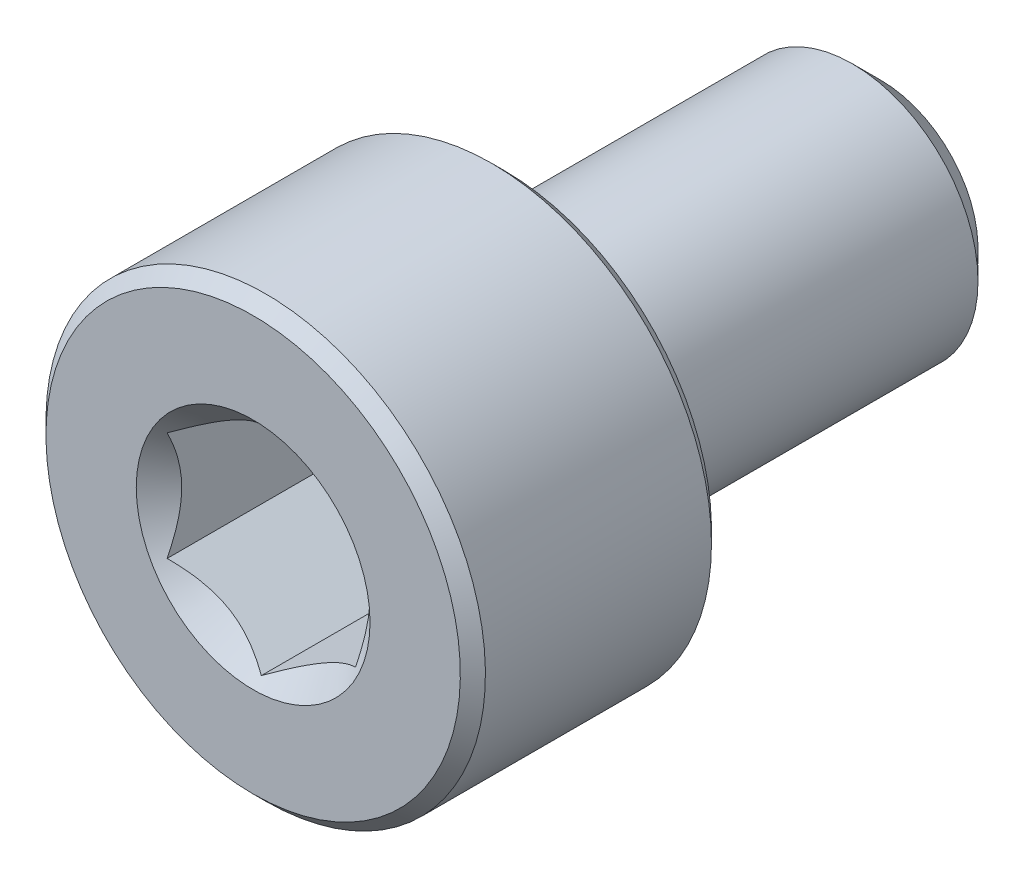
ISO-10303-21;
HEADER;
FILE_DESCRIPTION(('STEP AP214'),'2;1');
FILE_NAME('part.step','',(''),(''),'','','');
FILE_SCHEMA(('AUTOMOTIVE_DESIGN { 1 0 10303 214 1 1 1 1 }'));
ENDSEC;
DATA;
#1=APPLICATION_CONTEXT('core data for automotive mechanical design processes');
#2=APPLICATION_PROTOCOL_DEFINITION('international standard','automotive_design',2000,#1);
#3=PRODUCT_CONTEXT('',#1,'mechanical');
#4=PRODUCT('Part','Part','',(#3));
#5=PRODUCT_RELATED_PRODUCT_CATEGORY('part','',(#4));
#6=PRODUCT_DEFINITION_FORMATION('','',#4);
#7=PRODUCT_DEFINITION_CONTEXT('part definition',#1,'design');
#8=PRODUCT_DEFINITION('design','',#6,#7);
#9=PRODUCT_DEFINITION_SHAPE('','',#8);
#10=(LENGTH_UNIT() NAMED_UNIT(*) SI_UNIT(.MILLI.,.METRE.));
#11=(NAMED_UNIT(*) PLANE_ANGLE_UNIT() SI_UNIT($,.RADIAN.));
#12=(NAMED_UNIT(*) SI_UNIT($,.STERADIAN.) SOLID_ANGLE_UNIT());
#13=UNCERTAINTY_MEASURE_WITH_UNIT(LENGTH_MEASURE(1.E-05),#10,'distance_accuracy_value','');
#14=(GEOMETRIC_REPRESENTATION_CONTEXT(3) GLOBAL_UNCERTAINTY_ASSIGNED_CONTEXT((#13)) GLOBAL_UNIT_ASSIGNED_CONTEXT((#10,
#11,#12)) REPRESENTATION_CONTEXT('',''));
#15=CARTESIAN_POINT('',(0.,0.,0.));
#16=DIRECTION('',(0.,0.,1.));
#17=DIRECTION('',(1.,0.,0.));
#18=AXIS2_PLACEMENT_3D('',#15,#16,#17);
#19=CARTESIAN_POINT('',(1.5,-0.866025403784439,-3.58257569495584));
#20=DIRECTION('',(1.,0.,0.));
#21=DIRECTION('',(0.,1.,0.));
#22=AXIS2_PLACEMENT_3D('',#19,#20,#21);
#23=PLANE('',#22);
#24=DIRECTION('',(0.,0.,1.));
#25=VECTOR('',#24,1.);
#26=CARTESIAN_POINT('',(1.5,-0.866025403784439,-3.58257569495584));
#27=LINE('',#26,#25);
#28=CARTESIAN_POINT('',(1.5,-0.866025403784439,2.));
#29=VERTEX_POINT('',#28);
#30=CARTESIAN_POINT('',(1.5,-0.866025403784439,4.87009618943233));
#31=VERTEX_POINT('',#30);
#32=EDGE_CURVE('E136',#29,#31,#27,.T.);
#33=ORIENTED_EDGE('',*,*,#32,.T.);
#34=CARTESIAN_POINT('',(1.5,-0.866025403784437,4.87009618943233));
#35=CARTESIAN_POINT('',(1.5,0.,4.43708348754012));
#36=CARTESIAN_POINT('',(1.5,0.866025403784436,4.87009618943233));
#37=(BOUNDED_CURVE() B_SPLINE_CURVE(2,(#34,#35,#36),.UNSPECIFIED.,.F.,
.F.) B_SPLINE_CURVE_WITH_KNOTS((3,3),(-0.41309519357444,-0.145320587654442),
.UNSPECIFIED.) CURVE() GEOMETRIC_REPRESENTATION_ITEM() RATIONAL_B_SPLINE_CURVE((1.34959345562317,
1.55837628980119,1.34959345562317)) REPRESENTATION_ITEM(''));
#38=CARTESIAN_POINT('',(1.5,0.866025403784439,4.87009618943233));
#39=VERTEX_POINT('',#38);
#40=EDGE_CURVE('E139',#31,#39,#37,.T.);
#41=ORIENTED_EDGE('',*,*,#40,.T.);
#42=DIRECTION('',(0.,0.,1.));
#43=VECTOR('',#42,1.);
#44=CARTESIAN_POINT('',(1.5,0.866025403784439,-3.58257569495584));
#45=LINE('',#44,#43);
#46=CARTESIAN_POINT('',(1.5,0.866025403784439,2.));
#47=VERTEX_POINT('',#46);
#48=EDGE_CURVE('E11',#47,#39,#45,.T.);
#49=ORIENTED_EDGE('',*,*,#48,.F.);
#50=DIRECTION('',(0.,1.,0.));
#51=VECTOR('',#50,1.);
#52=CARTESIAN_POINT('',(1.5,-0.866025403784439,2.));
#53=LINE('',#52,#51);
#54=EDGE_CURVE('E141',#29,#47,#53,.T.);
#55=ORIENTED_EDGE('',*,*,#54,.F.);
#56=EDGE_LOOP('',(#33,#41,#49,#55));
#57=FACE_BOUND('',#56,.T.);
#58=ADVANCED_FACE('F17',(#57),#23,.F.);
#59=CARTESIAN_POINT('',(1.5,0.866025403784439,-3.58257569495584));
#60=DIRECTION('',(0.5,0.866025403784439,0.));
#61=DIRECTION('',(0.,0.,-1.));
#62=AXIS2_PLACEMENT_3D('',#59,#60,#61);
#63=PLANE('',#62);
#64=ORIENTED_EDGE('',*,*,#48,.T.);
#65=CARTESIAN_POINT('',(1.5,0.86602540378444,4.87009618943233));
#66=CARTESIAN_POINT('',(0.749999999999998,1.29903810567666,4.43708348754012));
#67=CARTESIAN_POINT('',(0.,1.73205080756888,4.87009618943233));
#68=(BOUNDED_CURVE() B_SPLINE_CURVE(2,(#65,#66,#67),.UNSPECIFIED.,.F.,
.F.) B_SPLINE_CURVE_WITH_KNOTS((3,3),(-0.413095193574439,-0.145320587654442),
.UNSPECIFIED.) CURVE() GEOMETRIC_REPRESENTATION_ITEM() RATIONAL_B_SPLINE_CURVE((1.34959345562317,
1.55837628980119,1.34959345562317)) REPRESENTATION_ITEM(''));
#69=CARTESIAN_POINT('',(0.,1.73205080756888,4.87009618943233));
#70=VERTEX_POINT('',#69);
#71=EDGE_CURVE('E161',#39,#70,#68,.T.);
#72=ORIENTED_EDGE('',*,*,#71,.T.);
#73=DIRECTION('',(0.,0.,1.));
#74=VECTOR('',#73,1.);
#75=CARTESIAN_POINT('',(0.,1.73205080756888,-3.58257569495584));
#76=LINE('',#75,#74);
#77=CARTESIAN_POINT('',(0.,1.73205080756888,2.));
#78=VERTEX_POINT('',#77);
#79=EDGE_CURVE('E25',#78,#70,#76,.T.);
#80=ORIENTED_EDGE('',*,*,#79,.F.);
#81=DIRECTION('',(-0.866025403784439,0.5,0.));
#82=VECTOR('',#81,1.);
#83=CARTESIAN_POINT('',(1.5,0.866025403784439,2.));
#84=LINE('',#83,#82);
#85=EDGE_CURVE('E286',#47,#78,#84,.T.);
#86=ORIENTED_EDGE('',*,*,#85,.F.);
#87=EDGE_LOOP('',(#64,#72,#80,#86));
#88=FACE_BOUND('',#87,.T.);
#89=ADVANCED_FACE('F308',(#88),#63,.F.);
#90=CARTESIAN_POINT('',(0.,1.73205080756888,-3.58257569495584));
#91=DIRECTION('',(-0.5,0.866025403784439,0.));
#92=DIRECTION('',(0.,0.,1.));
#93=AXIS2_PLACEMENT_3D('',#90,#91,#92);
#94=PLANE('',#93);
#95=ORIENTED_EDGE('',*,*,#79,.T.);
#96=CARTESIAN_POINT('',(0.,1.73205080756888,4.87009618943233));
#97=CARTESIAN_POINT('',(-0.75,1.29903810567666,4.43708348754012));
#98=CARTESIAN_POINT('',(-1.5,0.86602540378444,4.87009618943233));
#99=(BOUNDED_CURVE() B_SPLINE_CURVE(2,(#96,#97,#98),.UNSPECIFIED.,.F.,
.F.) B_SPLINE_CURVE_WITH_KNOTS((3,3),(-0.41309519357444,-0.145320587654442),
.UNSPECIFIED.) CURVE() GEOMETRIC_REPRESENTATION_ITEM() RATIONAL_B_SPLINE_CURVE((1.34959345562317,
1.55837628980119,1.34959345562317)) REPRESENTATION_ITEM(''));
#100=CARTESIAN_POINT('',(-1.5,0.866025403784439,4.87009618943233));
#101=VERTEX_POINT('',#100);
#102=EDGE_CURVE('E170',#70,#101,#99,.T.);
#103=ORIENTED_EDGE('',*,*,#102,.T.);
#104=DIRECTION('',(0.,0.,1.));
#105=VECTOR('',#104,1.);
#106=CARTESIAN_POINT('',(-1.5,0.866025403784438,-3.58257569495584));
#107=LINE('',#106,#105);
#108=CARTESIAN_POINT('',(-1.5,0.866025403784439,2.));
#109=VERTEX_POINT('',#108);
#110=EDGE_CURVE('E47',#109,#101,#107,.T.);
#111=ORIENTED_EDGE('',*,*,#110,.F.);
#112=DIRECTION('',(-0.866025403784439,-0.5,0.));
#113=VECTOR('',#112,1.);
#114=CARTESIAN_POINT('',(0.,1.73205080756888,2.));
#115=LINE('',#114,#113);
#116=EDGE_CURVE('E212',#78,#109,#115,.T.);
#117=ORIENTED_EDGE('',*,*,#116,.F.);
#118=EDGE_LOOP('',(#95,#103,#111,#117));
#119=FACE_BOUND('',#118,.T.);
#120=ADVANCED_FACE('F304',(#119),#94,.F.);
#121=CARTESIAN_POINT('',(-1.5,0.866025403784438,-3.58257569495584));
#122=DIRECTION('',(-1.,0.,0.));
#123=DIRECTION('',(0.,0.,1.));
#124=AXIS2_PLACEMENT_3D('',#121,#122,#123);
#125=PLANE('',#124);
#126=ORIENTED_EDGE('',*,*,#110,.T.);
#127=CARTESIAN_POINT('',(-1.5,0.866025403784437,4.87009618943233));
#128=CARTESIAN_POINT('',(-1.5,0.401923788646683,4.63804538186346));
#129=CARTESIAN_POINT('',(-1.5,0.,4.63804538186346));
#130=(BOUNDED_CURVE() B_SPLINE_CURVE(2,(#127,#128,#129),.UNSPECIFIED.,.F.,
.F.) B_SPLINE_CURVE_WITH_KNOTS((3,3),(-0.41309519357444,-0.279207890614441),
.UNSPECIFIED.) CURVE() GEOMETRIC_REPRESENTATION_ITEM() RATIONAL_B_SPLINE_CURVE((1.34959345562317,
1.45398487271218,1.45398487271218)) REPRESENTATION_ITEM(''));
#131=CARTESIAN_POINT('',(-1.5,0.,4.63804538186346));
#132=VERTEX_POINT('',#131);
#133=EDGE_CURVE('E225',#101,#132,#130,.T.);
#134=ORIENTED_EDGE('',*,*,#133,.T.);
#135=CARTESIAN_POINT('',(-1.5,0.,4.63804538186346));
#136=CARTESIAN_POINT('',(-1.5,-0.401923788646682,4.63804538186346));
#137=CARTESIAN_POINT('',(-1.5,-0.866025403784434,4.87009618943233));
#138=(BOUNDED_CURVE() B_SPLINE_CURVE(2,(#135,#136,#137),.UNSPECIFIED.,.F.,
.F.) B_SPLINE_CURVE_WITH_KNOTS((3,3),(-0.279207890614441,-0.145320587654442),
.UNSPECIFIED.) CURVE() GEOMETRIC_REPRESENTATION_ITEM() RATIONAL_B_SPLINE_CURVE((1.45398487271218,
1.45398487271218,1.34959345562317)) REPRESENTATION_ITEM(''));
#139=CARTESIAN_POINT('',(-1.5,-0.866025403784439,4.87009618943233));
#140=VERTEX_POINT('',#139);
#141=EDGE_CURVE('E187',#132,#140,#138,.T.);
#142=ORIENTED_EDGE('',*,*,#141,.T.);
#143=DIRECTION('',(0.,0.,1.));
#144=VECTOR('',#143,1.);
#145=CARTESIAN_POINT('',(-1.5,-0.866025403784439,-3.58257569495584));
#146=LINE('',#145,#144);
#147=CARTESIAN_POINT('',(-1.5,-0.866025403784439,2.));
#148=VERTEX_POINT('',#147);
#149=EDGE_CURVE('E37',#148,#140,#146,.T.);
#150=ORIENTED_EDGE('',*,*,#149,.F.);
#151=DIRECTION('',(0.,-1.,0.));
#152=VECTOR('',#151,1.);
#153=CARTESIAN_POINT('',(-1.5,0.866025403784438,2.));
#154=LINE('',#153,#152);
#155=EDGE_CURVE('E204',#109,#148,#154,.T.);
#156=ORIENTED_EDGE('',*,*,#155,.F.);
#157=EDGE_LOOP('',(#126,#134,#142,#150,#156));
#158=FACE_BOUND('',#157,.T.);
#159=ADVANCED_FACE('F449',(#158),#125,.F.);
#160=CARTESIAN_POINT('',(-1.5,-0.866025403784439,-3.58257569495584));
#161=DIRECTION('',(-0.5,-0.866025403784439,0.));
#162=DIRECTION('',(-0.866025403784439,0.5,0.));
#163=AXIS2_PLACEMENT_3D('',#160,#161,#162);
#164=PLANE('',#163);
#165=ORIENTED_EDGE('',*,*,#149,.T.);
#166=CARTESIAN_POINT('',(-1.5,-0.866025403784442,4.87009618943233));
#167=CARTESIAN_POINT('',(-0.749999999999998,-1.29903810567666,4.43708348754012));
#168=CARTESIAN_POINT('',(0.,-1.73205080756888,4.87009618943233));
#169=(BOUNDED_CURVE() B_SPLINE_CURVE(2,(#166,#167,#168),.UNSPECIFIED.,.F.,
.F.) B_SPLINE_CURVE_WITH_KNOTS((3,3),(-0.413095193574439,-0.145320587654442),
.UNSPECIFIED.) CURVE() GEOMETRIC_REPRESENTATION_ITEM() RATIONAL_B_SPLINE_CURVE((1.34959345562317,
1.55837628980119,1.34959345562317)) REPRESENTATION_ITEM(''));
#170=CARTESIAN_POINT('',(0.,-1.73205080756888,4.87009618943233));
#171=VERTEX_POINT('',#170);
#172=EDGE_CURVE('E155',#140,#171,#169,.T.);
#173=ORIENTED_EDGE('',*,*,#172,.T.);
#174=DIRECTION('',(0.,0.,1.));
#175=VECTOR('',#174,1.);
#176=CARTESIAN_POINT('',(0.,-1.73205080756888,-3.58257569495584));
#177=LINE('',#176,#175);
#178=CARTESIAN_POINT('',(0.,-1.73205080756888,2.));
#179=VERTEX_POINT('',#178);
#180=EDGE_CURVE('E146',#179,#171,#177,.T.);
#181=ORIENTED_EDGE('',*,*,#180,.F.);
#182=DIRECTION('',(0.866025403784439,-0.5,0.));
#183=VECTOR('',#182,1.);
#184=CARTESIAN_POINT('',(-1.5,-0.866025403784439,2.));
#185=LINE('',#184,#183);
#186=EDGE_CURVE('E211',#148,#179,#185,.T.);
#187=ORIENTED_EDGE('',*,*,#186,.F.);
#188=EDGE_LOOP('',(#165,#173,#181,#187));
#189=FACE_BOUND('',#188,.T.);
#190=ADVANCED_FACE('F454',(#189),#164,.F.);
#191=CARTESIAN_POINT('',(0.,-1.73205080756888,-3.58257569495584));
#192=DIRECTION('',(0.5,-0.866025403784439,0.));
#193=DIRECTION('',(0.,0.,-1.));
#194=AXIS2_PLACEMENT_3D('',#191,#192,#193);
#195=PLANE('',#194);
#196=ORIENTED_EDGE('',*,*,#180,.T.);
#197=CARTESIAN_POINT('',(0.,-1.73205080756887,4.87009618943233));
#198=CARTESIAN_POINT('',(0.750000000000001,-1.29903810567666,4.43708348754012));
#199=CARTESIAN_POINT('',(1.5,-0.86602540378444,4.87009618943233));
#200=(BOUNDED_CURVE() B_SPLINE_CURVE(2,(#197,#198,#199),.UNSPECIFIED.,.F.,
.F.) B_SPLINE_CURVE_WITH_KNOTS((3,3),(-0.413095193574439,-0.145320587654442),
.UNSPECIFIED.) CURVE() GEOMETRIC_REPRESENTATION_ITEM() RATIONAL_B_SPLINE_CURVE((1.34959345562317,
1.55837628980119,1.34959345562317)) REPRESENTATION_ITEM(''));
#201=EDGE_CURVE('E149',#171,#31,#200,.T.);
#202=ORIENTED_EDGE('',*,*,#201,.T.);
#203=ORIENTED_EDGE('',*,*,#32,.F.);
#204=DIRECTION('',(0.866025403784439,0.5,0.));
#205=VECTOR('',#204,1.);
#206=CARTESIAN_POINT('',(0.,-1.73205080756888,2.));
#207=LINE('',#206,#205);
#208=EDGE_CURVE('E281',#179,#29,#207,.T.);
#209=ORIENTED_EDGE('',*,*,#208,.F.);
#210=EDGE_LOOP('',(#196,#202,#203,#209));
#211=FACE_BOUND('',#210,.T.);
#212=ADVANCED_FACE('F150',(#211),#195,.F.);
#213=CARTESIAN_POINT('',(0.,3.3,2.));
#214=DIRECTION('',(0.,0.,-1.));
#215=DIRECTION('',(-1.,0.,0.));
#216=AXIS2_PLACEMENT_3D('',#213,#214,#215);
#217=PLANE('',#216);
#218=ORIENTED_EDGE('',*,*,#208,.T.);
#219=ORIENTED_EDGE('',*,*,#54,.T.);
#220=ORIENTED_EDGE('',*,*,#85,.T.);
#221=ORIENTED_EDGE('',*,*,#116,.T.);
#222=ORIENTED_EDGE('',*,*,#155,.T.);
#223=ORIENTED_EDGE('',*,*,#186,.T.);
#224=EDGE_LOOP('',(#218,#219,#220,#221,#222,#223));
#225=FACE_BOUND('',#224,.T.);
#226=ADVANCED_FACE('F423',(#225),#217,.F.);
#227=CARTESIAN_POINT('',(0.,0.,5.));
#228=DIRECTION('',(0.,0.,1.));
#229=DIRECTION('',(0.,-1.,0.));
#230=AXIS2_PLACEMENT_3D('',#227,#228,#229);
#231=PLANE('',#230);
#232=CARTESIAN_POINT('',(0.,0.,5.));
#233=DIRECTION('',(0.,0.,1.));
#234=DIRECTION('',(1.,0.,0.));
#235=AXIS2_PLACEMENT_3D('',#232,#233,#234);
#236=CIRCLE('',#235,1.86195461813654);
#237=CARTESIAN_POINT('',(-1.86195461813654,0.,5.));
#238=VERTEX_POINT('',#237);
#239=EDGE_CURVE('E216',#238,#238,#236,.T.);
#240=ORIENTED_EDGE('',*,*,#239,.F.);
#241=EDGE_LOOP('',(#240));
#242=FACE_BOUND('',#241,.T.);
#243=CARTESIAN_POINT('',(0.,0.,5.));
#244=DIRECTION('',(0.,0.,-1.));
#245=DIRECTION('',(0.,1.,0.));
#246=AXIS2_PLACEMENT_3D('',#243,#244,#245);
#247=CIRCLE('',#246,3.3);
#248=CARTESIAN_POINT('',(0.,-3.3,5.));
#249=VERTEX_POINT('',#248);
#250=EDGE_CURVE('E243',#249,#249,#247,.T.);
#251=ORIENTED_EDGE('',*,*,#250,.F.);
#252=EDGE_LOOP('',(#251));
#253=FACE_BOUND('',#252,.T.);
#254=ADVANCED_FACE('F420',(#242,#253),#231,.T.);
#255=CARTESIAN_POINT('',(0.,3.3,1.));
#256=DIRECTION('',(0.,0.,-1.));
#257=DIRECTION('',(-1.,0.,0.));
#258=AXIS2_PLACEMENT_3D('',#255,#256,#257);
#259=PLANE('',#258);
#260=CARTESIAN_POINT('',(0.,0.,1.));
#261=DIRECTION('',(0.,0.,-1.));
#262=DIRECTION('',(0.,1.,0.));
#263=AXIS2_PLACEMENT_3D('',#260,#261,#262);
#264=CIRCLE('',#263,2.2);
#265=CARTESIAN_POINT('',(0.,-2.2,1.));
#266=VERTEX_POINT('',#265);
#267=EDGE_CURVE('E222',#266,#266,#264,.T.);
#268=ORIENTED_EDGE('',*,*,#267,.F.);
#269=EDGE_LOOP('',(#268));
#270=FACE_BOUND('',#269,.T.);
#271=CARTESIAN_POINT('',(0.,0.,1.));
#272=DIRECTION('',(0.,0.,-1.));
#273=DIRECTION('',(0.,1.,0.));
#274=AXIS2_PLACEMENT_3D('',#271,#272,#273);
#275=CIRCLE('',#274,3.3);
#276=CARTESIAN_POINT('',(0.,3.3,1.));
#277=VERTEX_POINT('',#276);
#278=EDGE_CURVE('E237',#277,#277,#275,.T.);
#279=ORIENTED_EDGE('',*,*,#278,.T.);
#280=EDGE_LOOP('',(#279));
#281=FACE_BOUND('',#280,.T.);
#282=ADVANCED_FACE('F422',(#270,#281),#259,.T.);
#283=CARTESIAN_POINT('',(0.,1.54533666301317,-5.));
#284=DIRECTION('',(0.,0.,-1.));
#285=DIRECTION('',(-1.,0.,0.));
#286=AXIS2_PLACEMENT_3D('',#283,#284,#285);
#287=PLANE('',#286);
#288=CARTESIAN_POINT('',(0.,0.,-5.));
#289=DIRECTION('',(0.,0.,-1.));
#290=DIRECTION('',(0.,1.,0.));
#291=AXIS2_PLACEMENT_3D('',#288,#289,#290);
#292=CIRCLE('',#291,1.54533666301317);
#293=CARTESIAN_POINT('',(0.,1.54533666301317,-5.));
#294=VERTEX_POINT('',#293);
#295=EDGE_CURVE('E278',#294,#294,#292,.T.);
#296=ORIENTED_EDGE('',*,*,#295,.T.);
#297=EDGE_LOOP('',(#296));
#298=FACE_BOUND('',#297,.T.);
#299=ADVANCED_FACE('F432',(#298),#287,.T.);
#300=CARTESIAN_POINT('',(0.,0.,-5.));
#301=DIRECTION('',(0.,0.,1.));
#302=DIRECTION('',(0.,-1.,0.));
#303=AXIS2_PLACEMENT_3D('',#300,#301,#302);
#304=CONICAL_SURFACE('',#303,1.54533666301317,0.785398163397446);
#305=CARTESIAN_POINT('',(0.,0.,-4.54533666301317));
#306=DIRECTION('',(0.,0.,-1.));
#307=DIRECTION('',(0.,1.,0.));
#308=AXIS2_PLACEMENT_3D('',#305,#306,#307);
#309=CIRCLE('',#308,2.);
#310=CARTESIAN_POINT('',(0.,2.,-4.54533666301317));
#311=VERTEX_POINT('',#310);
#312=CARTESIAN_POINT('',(0.,-2.,-4.54533666301317));
#313=VERTEX_POINT('',#312);
#314=EDGE_CURVE('E217',#311,#313,#309,.T.);
#315=ORIENTED_EDGE('',*,*,#314,.T.);
#316=CARTESIAN_POINT('',(0.,0.,-4.54533666301317));
#317=DIRECTION('',(0.,0.,-1.));
#318=DIRECTION('',(0.,1.,0.));
#319=AXIS2_PLACEMENT_3D('',#316,#317,#318);
#320=CIRCLE('',#319,2.);
#321=EDGE_CURVE('E221',#313,#311,#320,.T.);
#322=ORIENTED_EDGE('',*,*,#321,.T.);
#323=DIRECTION('',(0.,-0.707106781186546,-0.707106781186549));
#324=VECTOR('',#323,1.);
#325=CARTESIAN_POINT('',(0.,1.54533666301317,-5.));
#326=LINE('',#325,#324);
#327=EDGE_CURVE('E274',#311,#294,#326,.T.);
#328=ORIENTED_EDGE('',*,*,#327,.T.);
#329=ORIENTED_EDGE('',*,*,#295,.F.);
#330=ORIENTED_EDGE('',*,*,#327,.F.);
#331=EDGE_LOOP('',(#315,#322,#328,#329,#330));
#332=FACE_BOUND('',#331,.T.);
#333=ADVANCED_FACE('F457',(#332),#304,.T.);
#334=CARTESIAN_POINT('',(0.,0.,-5.));
#335=DIRECTION('',(0.,0.,-1.));
#336=DIRECTION('',(0.,1.,0.));
#337=AXIS2_PLACEMENT_3D('',#334,#335,#336);
#338=CYLINDRICAL_SURFACE('',#337,2.);
#339=ORIENTED_EDGE('',*,*,#314,.F.);
#340=ORIENTED_EDGE('',*,*,#321,.F.);
#341=DIRECTION('',(0.,0.,1.));
#342=VECTOR('',#341,1.);
#343=CARTESIAN_POINT('',(0.,-2.,-5.));
#344=LINE('',#343,#342);
#345=CARTESIAN_POINT('',(0.,-2.,0.8));
#346=VERTEX_POINT('',#345);
#347=EDGE_CURVE('E269',#313,#346,#344,.T.);
#348=ORIENTED_EDGE('',*,*,#347,.T.);
#349=CARTESIAN_POINT('',(0.,0.,0.8));
#350=DIRECTION('',(0.,0.,-1.));
#351=DIRECTION('',(0.,1.,0.));
#352=AXIS2_PLACEMENT_3D('',#349,#350,#351);
#353=CIRCLE('',#352,2.);
#354=EDGE_CURVE('E258',#346,#346,#353,.T.);
#355=ORIENTED_EDGE('',*,*,#354,.T.);
#356=ORIENTED_EDGE('',*,*,#347,.F.);
#357=EDGE_LOOP('',(#339,#340,#348,#355,#356));
#358=FACE_BOUND('',#357,.T.);
#359=ADVANCED_FACE('F460',(#358),#338,.T.);
#360=CARTESIAN_POINT('',(0.,0.,0.8));
#361=DIRECTION('',(0.,0.,-1.));
#362=DIRECTION('',(0.,1.,0.));
#363=AXIS2_PLACEMENT_3D('',#360,#361,#362);
#364=TOROIDAL_SURFACE('',#363,2.2,0.2);
#365=ORIENTED_EDGE('',*,*,#354,.F.);
#366=CARTESIAN_POINT('',(0.,-2.2,0.8));
#367=DIRECTION('',(1.,0.,0.));
#368=DIRECTION('',(0.,-1.,0.));
#369=AXIS2_PLACEMENT_3D('',#366,#367,#368);
#370=CIRCLE('',#369,0.2);
#371=EDGE_CURVE('E262',#346,#266,#370,.T.);
#372=ORIENTED_EDGE('',*,*,#371,.T.);
#373=ORIENTED_EDGE('',*,*,#267,.T.);
#374=ORIENTED_EDGE('',*,*,#371,.F.);
#375=EDGE_LOOP('',(#365,#372,#373,#374));
#376=FACE_BOUND('',#375,.T.);
#377=ADVANCED_FACE('F464',(#376),#364,.F.);
#378=CARTESIAN_POINT('',(0.,0.,1.));
#379=DIRECTION('',(0.,0.,1.));
#380=DIRECTION('',(0.,-1.,0.));
#381=AXIS2_PLACEMENT_3D('',#378,#379,#380);
#382=CONICAL_SURFACE('',#381,3.3,0.785398163397447);
#383=CARTESIAN_POINT('',(0.,0.,1.2));
#384=DIRECTION('',(0.,0.,-1.));
#385=DIRECTION('',(0.,1.,0.));
#386=AXIS2_PLACEMENT_3D('',#383,#384,#385);
#387=CIRCLE('',#386,3.5);
#388=CARTESIAN_POINT('',(0.,3.5,1.2));
#389=VERTEX_POINT('',#388);
#390=CARTESIAN_POINT('',(0.,-3.5,1.2));
#391=VERTEX_POINT('',#390);
#392=EDGE_CURVE('E246',#389,#391,#387,.T.);
#393=ORIENTED_EDGE('',*,*,#392,.T.);
#394=CARTESIAN_POINT('',(0.,0.,1.2));
#395=DIRECTION('',(0.,0.,-1.));
#396=DIRECTION('',(0.,1.,0.));
#397=AXIS2_PLACEMENT_3D('',#394,#395,#396);
#398=CIRCLE('',#397,3.5);
#399=EDGE_CURVE('E253',#391,#389,#398,.T.);
#400=ORIENTED_EDGE('',*,*,#399,.T.);
#401=DIRECTION('',(0.,-0.707106781186547,-0.707106781186548));
#402=VECTOR('',#401,1.);
#403=CARTESIAN_POINT('',(0.,3.3,1.));
#404=LINE('',#403,#402);
#405=EDGE_CURVE('E230',#389,#277,#404,.T.);
#406=ORIENTED_EDGE('',*,*,#405,.T.);
#407=ORIENTED_EDGE('',*,*,#278,.F.);
#408=ORIENTED_EDGE('',*,*,#405,.F.);
#409=EDGE_LOOP('',(#393,#400,#406,#407,#408));
#410=FACE_BOUND('',#409,.T.);
#411=ADVANCED_FACE('F410',(#410),#382,.T.);
#412=CARTESIAN_POINT('',(0.,0.,-5.));
#413=DIRECTION('',(0.,0.,-1.));
#414=DIRECTION('',(0.,1.,0.));
#415=AXIS2_PLACEMENT_3D('',#412,#413,#414);
#416=CYLINDRICAL_SURFACE('',#415,3.5);
#417=ORIENTED_EDGE('',*,*,#392,.F.);
#418=ORIENTED_EDGE('',*,*,#399,.F.);
#419=DIRECTION('',(0.,0.,1.));
#420=VECTOR('',#419,1.);
#421=CARTESIAN_POINT('',(0.,-3.5,-5.));
#422=LINE('',#421,#420);
#423=CARTESIAN_POINT('',(0.,-3.5,4.8));
#424=VERTEX_POINT('',#423);
#425=EDGE_CURVE('E238',#391,#424,#422,.T.);
#426=ORIENTED_EDGE('',*,*,#425,.T.);
#427=CARTESIAN_POINT('',(0.,0.,4.8));
#428=DIRECTION('',(0.,0.,-1.));
#429=DIRECTION('',(0.,1.,0.));
#430=AXIS2_PLACEMENT_3D('',#427,#428,#429);
#431=CIRCLE('',#430,3.5);
#432=EDGE_CURVE('E195',#424,#424,#431,.T.);
#433=ORIENTED_EDGE('',*,*,#432,.T.);
#434=ORIENTED_EDGE('',*,*,#425,.F.);
#435=EDGE_LOOP('',(#417,#418,#426,#433,#434));
#436=FACE_BOUND('',#435,.T.);
#437=ADVANCED_FACE('F413',(#436),#416,.T.);
#438=CARTESIAN_POINT('',(0.,0.,4.8));
#439=DIRECTION('',(0.,0.,-1.));
#440=DIRECTION('',(0.,1.,0.));
#441=AXIS2_PLACEMENT_3D('',#438,#439,#440);
#442=CONICAL_SURFACE('',#441,3.5,0.785398163397452);
#443=ORIENTED_EDGE('',*,*,#432,.F.);
#444=DIRECTION('',(0.,0.70710678118655,0.707106781186545));
#445=VECTOR('',#444,1.);
#446=CARTESIAN_POINT('',(0.,-3.5,4.8));
#447=LINE('',#446,#445);
#448=EDGE_CURVE('E242',#424,#249,#447,.T.);
#449=ORIENTED_EDGE('',*,*,#448,.T.);
#450=ORIENTED_EDGE('',*,*,#250,.T.);
#451=ORIENTED_EDGE('',*,*,#448,.F.);
#452=EDGE_LOOP('',(#443,#449,#450,#451));
#453=FACE_BOUND('',#452,.T.);
#454=ADVANCED_FACE('F417',(#453),#442,.T.);
#455=CARTESIAN_POINT('',(0.,0.,5.));
#456=DIRECTION('',(0.,0.,1.));
#457=DIRECTION('',(1.,0.,0.));
#458=AXIS2_PLACEMENT_3D('',#455,#456,#457);
#459=CONICAL_SURFACE('',#458,1.86195461813654,0.78539816339745);
#460=ORIENTED_EDGE('',*,*,#40,.F.);
#461=ORIENTED_EDGE('',*,*,#201,.F.);
#462=ORIENTED_EDGE('',*,*,#172,.F.);
#463=ORIENTED_EDGE('',*,*,#141,.F.);
#464=DIRECTION('',(-0.707106781186549,0.,0.707106781186546));
#465=VECTOR('',#464,1.);
#466=CARTESIAN_POINT('',(-1.86195461813654,0.,5.));
#467=LINE('',#466,#465);
#468=EDGE_CURVE('E203',#132,#238,#467,.T.);
#469=ORIENTED_EDGE('',*,*,#468,.T.);
#470=ORIENTED_EDGE('',*,*,#239,.T.);
#471=ORIENTED_EDGE('',*,*,#468,.F.);
#472=ORIENTED_EDGE('',*,*,#133,.F.);
#473=ORIENTED_EDGE('',*,*,#102,.F.);
#474=ORIENTED_EDGE('',*,*,#71,.F.);
#475=EDGE_LOOP('',(#460,#461,#462,#463,#469,#470,#471,#472,#473,#474));
#476=FACE_BOUND('',#475,.T.);
#477=ADVANCED_FACE('F158',(#476),#459,.F.);
#478=CLOSED_SHELL('',(#58,#89,#120,#159,#190,#212,#226,#254,#282,#299,#333,#359,#377,#411,#437,
#454,#477));
#479=MANIFOLD_SOLID_BREP('B1',#478);
#480=ADVANCED_BREP_SHAPE_REPRESENTATION('',(#18,#479),#14);
#481=SHAPE_DEFINITION_REPRESENTATION(#9,#480);
ENDSEC;
END-ISO-10303-21;
